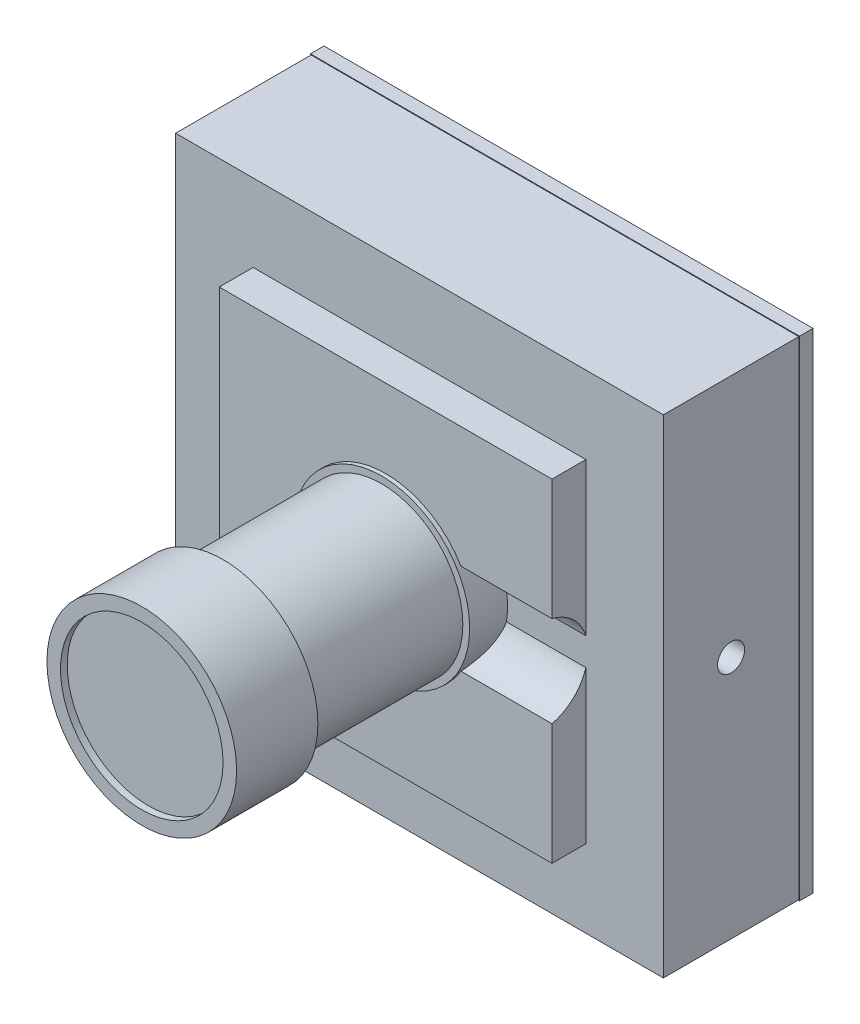
ISO-10303-21;
HEADER;
FILE_DESCRIPTION(('STEP AP214'),'2;1');
FILE_NAME('part.step','',(''),(''),'','','');
FILE_SCHEMA(('AUTOMOTIVE_DESIGN { 1 0 10303 214 1 1 1 1 }'));
ENDSEC;
DATA;
#1=APPLICATION_CONTEXT('core data for automotive mechanical design processes');
#2=APPLICATION_PROTOCOL_DEFINITION('international standard','automotive_design',2000,#1);
#3=PRODUCT_CONTEXT('',#1,'mechanical');
#4=PRODUCT('Part','Part','',(#3));
#5=PRODUCT_RELATED_PRODUCT_CATEGORY('part','',(#4));
#6=PRODUCT_DEFINITION_FORMATION('','',#4);
#7=PRODUCT_DEFINITION_CONTEXT('part definition',#1,'design');
#8=PRODUCT_DEFINITION('design','',#6,#7);
#9=PRODUCT_DEFINITION_SHAPE('','',#8);
#10=(LENGTH_UNIT() NAMED_UNIT(*) SI_UNIT(.MILLI.,.METRE.));
#11=(NAMED_UNIT(*) PLANE_ANGLE_UNIT() SI_UNIT($,.RADIAN.));
#12=(NAMED_UNIT(*) SI_UNIT($,.STERADIAN.) SOLID_ANGLE_UNIT());
#13=UNCERTAINTY_MEASURE_WITH_UNIT(LENGTH_MEASURE(1.E-05),#10,'distance_accuracy_value','');
#14=(GEOMETRIC_REPRESENTATION_CONTEXT(3) GLOBAL_UNCERTAINTY_ASSIGNED_CONTEXT((#13)) GLOBAL_UNIT_ASSIGNED_CONTEXT((#10,
#11,#12)) REPRESENTATION_CONTEXT('',''));
#15=CARTESIAN_POINT('',(0.,0.,0.));
#16=DIRECTION('',(0.,0.,1.));
#17=DIRECTION('',(1.,0.,0.));
#18=AXIS2_PLACEMENT_3D('',#15,#16,#17);
#19=CARTESIAN_POINT('',(12.28,-12.28,12.5));
#20=DIRECTION('',(-1.,0.,0.));
#21=DIRECTION('',(0.,0.,1.));
#22=AXIS2_PLACEMENT_3D('',#19,#20,#21);
#23=PLANE('',#22);
#24=DIRECTION('',(0.,1.,0.));
#25=VECTOR('',#24,1.);
#26=CARTESIAN_POINT('',(12.28,-12.28,10.));
#27=LINE('',#26,#25);
#28=CARTESIAN_POINT('',(12.28,-12.28,10.));
#29=VERTEX_POINT('',#28);
#30=CARTESIAN_POINT('',(12.28,-1.02023289507351,10.));
#31=VERTEX_POINT('',#30);
#32=EDGE_CURVE('E409',#29,#31,#27,.T.);
#33=ORIENTED_EDGE('',*,*,#32,.T.);
#34=CARTESIAN_POINT('',(12.28,0.,13.2956979290903));
#35=DIRECTION('',(1.,0.,0.));
#36=DIRECTION('',(0.,0.,1.));
#37=AXIS2_PLACEMENT_3D('',#34,#35,#36);
#38=CIRCLE('',#37,3.45);
#39=CARTESIAN_POINT('',(12.28,-3.35698745985764,12.5));
#40=VERTEX_POINT('',#39);
#41=EDGE_CURVE('E259',#40,#31,#38,.T.);
#42=ORIENTED_EDGE('',*,*,#41,.F.);
#43=DIRECTION('',(0.,1.,0.));
#44=VECTOR('',#43,1.);
#45=CARTESIAN_POINT('',(12.28,-12.28,12.5));
#46=LINE('',#45,#44);
#47=CARTESIAN_POINT('',(12.28,-12.28,12.5));
#48=VERTEX_POINT('',#47);
#49=EDGE_CURVE('E391',#48,#40,#46,.T.);
#50=ORIENTED_EDGE('',*,*,#49,.F.);
#51=DIRECTION('',(0.,0.,-1.));
#52=VECTOR('',#51,1.);
#53=CARTESIAN_POINT('',(12.28,-12.28,12.5));
#54=LINE('',#53,#52);
#55=EDGE_CURVE('E408',#48,#29,#54,.T.);
#56=ORIENTED_EDGE('',*,*,#55,.T.);
#57=EDGE_LOOP('',(#33,#42,#50,#56));
#58=FACE_BOUND('',#57,.T.);
#59=ADVANCED_FACE('F41',(#58),#23,.F.);
#60=CARTESIAN_POINT('',(0.,0.,24.5));
#61=DIRECTION('',(0.,0.,-1.));
#62=DIRECTION('',(-1.,0.,0.));
#63=AXIS2_PLACEMENT_3D('',#60,#61,#62);
#64=CYLINDRICAL_SURFACE('',#63,6.);
#65=CARTESIAN_POINT('',(0.,0.,12.8));
#66=DIRECTION('',(0.,0.,1.));
#67=DIRECTION('',(1.,0.,0.));
#68=AXIS2_PLACEMENT_3D('',#65,#66,#67);
#69=CIRCLE('',#68,6.);
#70=CARTESIAN_POINT('',(6.,0.,12.8));
#71=VERTEX_POINT('',#70);
#72=EDGE_CURVE('E457',#71,#71,#69,.T.);
#73=ORIENTED_EDGE('',*,*,#72,.T.);
#74=EDGE_LOOP('',(#73));
#75=FACE_BOUND('',#74,.T.);
#76=CARTESIAN_POINT('',(0.,0.,24.5));
#77=DIRECTION('',(0.,0.,1.));
#78=DIRECTION('',(1.,0.,0.));
#79=AXIS2_PLACEMENT_3D('',#76,#77,#78);
#80=CIRCLE('',#79,6.);
#81=CARTESIAN_POINT('',(6.,0.,24.5));
#82=VERTEX_POINT('',#81);
#83=EDGE_CURVE('E401',#82,#82,#80,.T.);
#84=ORIENTED_EDGE('',*,*,#83,.F.);
#85=EDGE_LOOP('',(#84));
#86=FACE_BOUND('',#85,.T.);
#87=ADVANCED_FACE('F359',(#75,#86),#64,.T.);
#88=CARTESIAN_POINT('',(0.,0.,30.5));
#89=DIRECTION('',(0.,0.,-1.));
#90=DIRECTION('',(-1.,0.,0.));
#91=AXIS2_PLACEMENT_3D('',#88,#89,#90);
#92=CYLINDRICAL_SURFACE('',#91,7.);
#93=CARTESIAN_POINT('',(0.,0.,30.5));
#94=DIRECTION('',(0.,0.,1.));
#95=DIRECTION('',(1.,0.,0.));
#96=AXIS2_PLACEMENT_3D('',#93,#94,#95);
#97=CIRCLE('',#96,7.);
#98=CARTESIAN_POINT('',(7.,0.,30.5));
#99=VERTEX_POINT('',#98);
#100=EDGE_CURVE('E475',#99,#99,#97,.T.);
#101=ORIENTED_EDGE('',*,*,#100,.F.);
#102=EDGE_LOOP('',(#101));
#103=FACE_BOUND('',#102,.T.);
#104=CARTESIAN_POINT('',(0.,0.,24.5));
#105=DIRECTION('',(0.,0.,1.));
#106=DIRECTION('',(1.,0.,0.));
#107=AXIS2_PLACEMENT_3D('',#104,#105,#106);
#108=CIRCLE('',#107,7.);
#109=CARTESIAN_POINT('',(7.,0.,24.5));
#110=VERTEX_POINT('',#109);
#111=EDGE_CURVE('E473',#110,#110,#108,.T.);
#112=ORIENTED_EDGE('',*,*,#111,.T.);
#113=EDGE_LOOP('',(#112));
#114=FACE_BOUND('',#113,.T.);
#115=ADVANCED_FACE('F366',(#103,#114),#92,.T.);
#116=CARTESIAN_POINT('',(0.,0.,30.5));
#117=DIRECTION('',(0.,0.,1.));
#118=DIRECTION('',(1.,0.,0.));
#119=AXIS2_PLACEMENT_3D('',#116,#117,#118);
#120=PLANE('',#119);
#121=CARTESIAN_POINT('',(0.,0.,30.5));
#122=DIRECTION('',(0.,0.,1.));
#123=DIRECTION('',(1.,0.,0.));
#124=AXIS2_PLACEMENT_3D('',#121,#122,#123);
#125=CIRCLE('',#124,6.);
#126=CARTESIAN_POINT('',(6.,0.,30.5));
#127=VERTEX_POINT('',#126);
#128=EDGE_CURVE('E459',#127,#127,#125,.T.);
#129=ORIENTED_EDGE('',*,*,#128,.F.);
#130=EDGE_LOOP('',(#129));
#131=FACE_BOUND('',#130,.T.);
#132=ORIENTED_EDGE('',*,*,#100,.T.);
#133=EDGE_LOOP('',(#132));
#134=FACE_BOUND('',#133,.T.);
#135=ADVANCED_FACE('F484',(#131,#134),#120,.T.);
#136=CARTESIAN_POINT('',(0.,0.,24.5));
#137=DIRECTION('',(0.,0.,1.));
#138=DIRECTION('',(1.,0.,0.));
#139=AXIS2_PLACEMENT_3D('',#136,#137,#138);
#140=PLANE('',#139);
#141=ORIENTED_EDGE('',*,*,#83,.T.);
#142=EDGE_LOOP('',(#141));
#143=FACE_BOUND('',#142,.T.);
#144=ORIENTED_EDGE('',*,*,#111,.F.);
#145=EDGE_LOOP('',(#144));
#146=FACE_BOUND('',#145,.T.);
#147=ADVANCED_FACE('F481',(#143,#146),#140,.F.);
#148=CARTESIAN_POINT('',(0.,0.,30.));
#149=DIRECTION('',(0.,0.,1.));
#150=DIRECTION('',(1.,0.,0.));
#151=AXIS2_PLACEMENT_3D('',#148,#149,#150);
#152=CYLINDRICAL_SURFACE('',#151,6.);
#153=CARTESIAN_POINT('',(0.,0.,30.));
#154=DIRECTION('',(0.,0.,1.));
#155=DIRECTION('',(1.,0.,0.));
#156=AXIS2_PLACEMENT_3D('',#153,#154,#155);
#157=CIRCLE('',#156,6.);
#158=CARTESIAN_POINT('',(6.,0.,30.));
#159=VERTEX_POINT('',#158);
#160=EDGE_CURVE('E463',#159,#159,#157,.T.);
#161=ORIENTED_EDGE('',*,*,#160,.F.);
#162=EDGE_LOOP('',(#161));
#163=FACE_BOUND('',#162,.T.);
#164=ORIENTED_EDGE('',*,*,#128,.T.);
#165=EDGE_LOOP('',(#164));
#166=FACE_BOUND('',#165,.T.);
#167=ADVANCED_FACE('F483',(#163,#166),#152,.F.);
#168=CARTESIAN_POINT('',(0.,0.,30.));
#169=DIRECTION('',(0.,0.,1.));
#170=DIRECTION('',(1.,0.,0.));
#171=AXIS2_PLACEMENT_3D('',#168,#169,#170);
#172=PLANE('',#171);
#173=ORIENTED_EDGE('',*,*,#160,.T.);
#174=EDGE_LOOP('',(#173));
#175=FACE_BOUND('',#174,.T.);
#176=ADVANCED_FACE('F284',(#175),#172,.T.);
#177=CARTESIAN_POINT('',(0.,0.,12.8));
#178=DIRECTION('',(0.,0.,-1.));
#179=DIRECTION('',(-1.,0.,0.));
#180=AXIS2_PLACEMENT_3D('',#177,#178,#179);
#181=CYLINDRICAL_SURFACE('',#180,6.5);
#182=CARTESIAN_POINT('',(0.,0.,12.8));
#183=DIRECTION('',(0.,0.,1.));
#184=DIRECTION('',(1.,0.,0.));
#185=AXIS2_PLACEMENT_3D('',#182,#183,#184);
#186=CIRCLE('',#185,6.5);
#187=CARTESIAN_POINT('',(6.5,0.,12.8));
#188=VERTEX_POINT('',#187);
#189=EDGE_CURVE('E460',#188,#188,#186,.T.);
#190=ORIENTED_EDGE('',*,*,#189,.F.);
#191=EDGE_LOOP('',(#190));
#192=FACE_BOUND('',#191,.T.);
#193=CARTESIAN_POINT('',(0.,0.,12.5));
#194=DIRECTION('',(0.,0.,-1.));
#195=DIRECTION('',(-1.,0.,0.));
#196=AXIS2_PLACEMENT_3D('',#193,#194,#195);
#197=CIRCLE('',#196,6.5);
#198=CARTESIAN_POINT('',(5.56602508028472,3.35698745985764,12.5));
#199=VERTEX_POINT('',#198);
#200=CARTESIAN_POINT('',(5.56602508028472,-3.35698745985764,12.5));
#201=VERTEX_POINT('',#200);
#202=EDGE_CURVE('E11',#199,#201,#197,.F.);
#203=ORIENTED_EDGE('',*,*,#202,.T.);
#204=CARTESIAN_POINT('',(5.56602508028472,-3.35698745985764,12.5));
#205=CARTESIAN_POINT('',(5.57955180700711,-3.33453979038569,12.4052884155102));
#206=CARTESIAN_POINT('',(5.59528315817957,-3.30817011921659,12.3119078433373));
#207=CARTESIAN_POINT('',(5.63045419741097,-3.2479583701722,12.1284000955498));
#208=CARTESIAN_POINT('',(5.64989044055717,-3.21412322933298,12.0382699894194));
#209=CARTESIAN_POINT('',(5.71259908682321,-3.10217473776604,11.7740240251298));
#210=CARTESIAN_POINT('',(5.76037986269082,-3.01344978345882,11.6053562810142));
#211=CARTESIAN_POINT('',(5.8617889603001,-2.81108384738308,11.2867412990591));
#212=CARTESIAN_POINT('',(5.91539872231677,-2.69752084669015,11.1367377257692));
#213=CARTESIAN_POINT('',(6.02311717254823,-2.44755817912961,10.8570324671436));
#214=CARTESIAN_POINT('',(6.0772261053561,-2.31114668596938,10.7273413630823));
#215=CARTESIAN_POINT('',(6.15846271917814,-2.08115678261641,10.5420078706021));
#216=CARTESIAN_POINT('',(6.1871926664556,-1.99436331532356,10.4784947018515));
#217=CARTESIAN_POINT('',(6.24225720743513,-1.81467538685393,10.3595348228013));
#218=CARTESIAN_POINT('',(6.26859207449666,-1.72178162401609,10.3040871915175));
#219=CARTESIAN_POINT('',(6.31809204329849,-1.53019975386337,10.2017012862647));
#220=CARTESIAN_POINT('',(6.34124672398576,-1.43149404320789,10.1547908316236));
#221=CARTESIAN_POINT('',(6.38354671265681,-1.22926376919297,10.070258513672));
#222=CARTESIAN_POINT('',(6.40268856750148,-1.12573514845534,10.0326446453708));
#223=CARTESIAN_POINT('',(6.41943337373401,-1.02023289507351,10.));
#224=B_SPLINE_CURVE_WITH_KNOTS('',3,(#204,#205,#206,#207,#208,#209,#210,#211,#212,#213,#214,
#215,#216,#217,#218,#219,#220,#221,#222,#223),.UNSPECIFIED.,.F.,.F.,(4,2,2,2,2,2,2,2,2,4),(0.,
0.294556840658693,0.588841118436535,1.17526685450148,1.75987723279939,2.34479114359943,
2.67834384162412,3.01185842212725,3.34644106199754,3.68131044751701),.UNSPECIFIED.);
#225=CARTESIAN_POINT('',(6.419433373734,-1.02023289507351,10.));
#226=VERTEX_POINT('',#225);
#227=EDGE_CURVE('E288',#201,#226,#224,.T.);
#228=ORIENTED_EDGE('',*,*,#227,.T.);
#229=CARTESIAN_POINT('',(0.,0.,10.));
#230=DIRECTION('',(0.,0.,-1.));
#231=DIRECTION('',(-1.,0.,0.));
#232=AXIS2_PLACEMENT_3D('',#229,#230,#231);
#233=CIRCLE('',#232,6.5);
#234=CARTESIAN_POINT('',(6.419433373734,1.02023289507351,10.));
#235=VERTEX_POINT('',#234);
#236=EDGE_CURVE('E273',#226,#235,#233,.F.);
#237=ORIENTED_EDGE('',*,*,#236,.T.);
#238=CARTESIAN_POINT('',(6.419433373734,1.02023289507351,10.));
#239=CARTESIAN_POINT('',(6.40457894522889,1.1137886441397,10.0289517871217));
#240=CARTESIAN_POINT('',(6.38784477980561,1.20580183277903,10.0618102463213));
#241=CARTESIAN_POINT('',(6.35115017251802,1.38611014075822,10.13490091659));
#242=CARTESIAN_POINT('',(6.33119203281755,1.47440785693412,10.1751278687177));
#243=CARTESIAN_POINT('',(6.28861614133241,1.646560204339,10.2624432920841));
#244=CARTESIAN_POINT('',(6.26600552332809,1.73042591150513,10.3095134368458));
#245=CARTESIAN_POINT('',(6.21866835550561,1.89351091780964,10.4101636047785));
#246=CARTESIAN_POINT('',(6.19394142336714,1.9727293730289,10.4637448049338));
#247=CARTESIAN_POINT('',(6.11761471582326,2.20243202195847,10.6333841534638));
#248=CARTESIAN_POINT('',(6.06372173756147,2.34553280087689,10.7586293239645));
#249=CARTESIAN_POINT('',(5.95507487177826,2.609114321631,11.0305303928114));
#250=CARTESIAN_POINT('',(5.90032071604706,2.72958785883179,11.1771930842787));
#251=CARTESIAN_POINT('',(5.789667815037,2.95762074621245,11.5070204787474));
#252=CARTESIAN_POINT('',(5.73431416865415,3.06227119506741,11.6924289783544));
#253=CARTESIAN_POINT('',(5.66183978014018,3.19313288538746,11.9850084074799));
#254=CARTESIAN_POINT('',(5.63940538924813,3.2324555459714,12.0851696007959));
#255=CARTESIAN_POINT('',(5.59906379188491,3.30182408967437,12.2896546594334));
#256=CARTESIAN_POINT('',(5.58116169816798,3.33185950449452,12.3939830734922));
#257=CARTESIAN_POINT('',(5.56602508028472,3.35698745985764,12.5));
#258=B_SPLINE_CURVE_WITH_KNOTS('',3,(#238,#239,#240,#241,#242,#243,#244,#245,#246,#247,#248,
#249,#250,#251,#252,#253,#254,#255,#256,#257),.UNSPECIFIED.,.F.,.F.,(4,2,2,2,2,2,2,2,2,4),(0.,
0.297004251508484,0.59379734927558,0.889809778982218,1.18587579780859,1.77606265836608,
2.36643712018191,3.02221015440024,3.35146986464702,3.68109936472817),.UNSPECIFIED.);
#259=EDGE_CURVE('E264',#235,#199,#258,.T.);
#260=ORIENTED_EDGE('',*,*,#259,.T.);
#261=EDGE_LOOP('',(#203,#228,#237,#260));
#262=FACE_BOUND('',#261,.T.);
#263=ADVANCED_FACE('F279',(#192,#262),#181,.T.);
#264=CARTESIAN_POINT('',(0.,0.,12.8));
#265=DIRECTION('',(0.,0.,1.));
#266=DIRECTION('',(1.,0.,0.));
#267=AXIS2_PLACEMENT_3D('',#264,#265,#266);
#268=PLANE('',#267);
#269=ORIENTED_EDGE('',*,*,#72,.F.);
#270=EDGE_LOOP('',(#269));
#271=FACE_BOUND('',#270,.T.);
#272=ORIENTED_EDGE('',*,*,#189,.T.);
#273=EDGE_LOOP('',(#272));
#274=FACE_BOUND('',#273,.T.);
#275=ADVANCED_FACE('F283',(#271,#274),#268,.T.);
#276=CARTESIAN_POINT('',(-18.,-18.,10.));
#277=DIRECTION('',(0.,1.,0.));
#278=DIRECTION('',(0.,0.,1.));
#279=AXIS2_PLACEMENT_3D('',#276,#277,#278);
#280=PLANE('',#279);
#281=DIRECTION('',(1.,0.,0.));
#282=VECTOR('',#281,1.);
#283=CARTESIAN_POINT('',(-18.,-18.,0.));
#284=LINE('',#283,#282);
#285=CARTESIAN_POINT('',(-18.,-18.,0.));
#286=VERTEX_POINT('',#285);
#287=CARTESIAN_POINT('',(18.,-18.,0.));
#288=VERTEX_POINT('',#287);
#289=EDGE_CURVE('E431',#286,#288,#284,.T.);
#290=ORIENTED_EDGE('',*,*,#289,.T.);
#291=DIRECTION('',(0.,0.,-1.));
#292=VECTOR('',#291,1.);
#293=CARTESIAN_POINT('',(18.,-18.,10.));
#294=LINE('',#293,#292);
#295=CARTESIAN_POINT('',(18.,-18.,10.));
#296=VERTEX_POINT('',#295);
#297=EDGE_CURVE('E437',#296,#288,#294,.T.);
#298=ORIENTED_EDGE('',*,*,#297,.F.);
#299=DIRECTION('',(1.,0.,0.));
#300=VECTOR('',#299,1.);
#301=CARTESIAN_POINT('',(-18.,-18.,10.));
#302=LINE('',#301,#300);
#303=CARTESIAN_POINT('',(-18.,-18.,10.));
#304=VERTEX_POINT('',#303);
#305=EDGE_CURVE('E435',#304,#296,#302,.T.);
#306=ORIENTED_EDGE('',*,*,#305,.F.);
#307=DIRECTION('',(0.,0.,-1.));
#308=VECTOR('',#307,1.);
#309=CARTESIAN_POINT('',(-18.,-18.,10.));
#310=LINE('',#309,#308);
#311=EDGE_CURVE('E450',#304,#286,#310,.T.);
#312=ORIENTED_EDGE('',*,*,#311,.T.);
#313=EDGE_LOOP('',(#290,#298,#306,#312));
#314=FACE_BOUND('',#313,.T.);
#315=ADVANCED_FACE('F676',(#314),#280,.F.);
#316=CARTESIAN_POINT('',(-18.,-18.,10.));
#317=DIRECTION('',(1.,0.,0.));
#318=DIRECTION('',(0.,0.,-1.));
#319=AXIS2_PLACEMENT_3D('',#316,#317,#318);
#320=PLANE('',#319);
#321=CARTESIAN_POINT('',(-18.,0.,5.));
#322=DIRECTION('',(1.,0.,0.));
#323=DIRECTION('',(0.,0.,-1.));
#324=AXIS2_PLACEMENT_3D('',#321,#322,#323);
#325=CIRCLE('',#324,1.);
#326=CARTESIAN_POINT('',(-18.,0.,4.));
#327=VERTEX_POINT('',#326);
#328=EDGE_CURVE('E246',#327,#327,#325,.T.);
#329=ORIENTED_EDGE('',*,*,#328,.T.);
#330=EDGE_LOOP('',(#329));
#331=FACE_BOUND('',#330,.T.);
#332=DIRECTION('',(0.,-1.,0.));
#333=VECTOR('',#332,1.);
#334=CARTESIAN_POINT('',(-18.,-18.,0.));
#335=LINE('',#334,#333);
#336=CARTESIAN_POINT('',(-18.,18.,0.));
#337=VERTEX_POINT('',#336);
#338=EDGE_CURVE('E443',#337,#286,#335,.T.);
#339=ORIENTED_EDGE('',*,*,#338,.T.);
#340=ORIENTED_EDGE('',*,*,#311,.F.);
#341=DIRECTION('',(0.,-1.,0.));
#342=VECTOR('',#341,1.);
#343=CARTESIAN_POINT('',(-18.,-18.,10.));
#344=LINE('',#343,#342);
#345=CARTESIAN_POINT('',(-18.,18.,10.));
#346=VERTEX_POINT('',#345);
#347=EDGE_CURVE('E433',#346,#304,#344,.T.);
#348=ORIENTED_EDGE('',*,*,#347,.F.);
#349=DIRECTION('',(0.,0.,-1.));
#350=VECTOR('',#349,1.);
#351=CARTESIAN_POINT('',(-18.,18.,10.));
#352=LINE('',#351,#350);
#353=EDGE_CURVE('E453',#346,#337,#352,.T.);
#354=ORIENTED_EDGE('',*,*,#353,.T.);
#355=EDGE_LOOP('',(#339,#340,#348,#354));
#356=FACE_BOUND('',#355,.T.);
#357=ADVANCED_FACE('F764',(#331,#356),#320,.F.);
#358=CARTESIAN_POINT('',(-18.,18.,10.));
#359=DIRECTION('',(0.,-1.,0.));
#360=DIRECTION('',(0.,0.,-1.));
#361=AXIS2_PLACEMENT_3D('',#358,#359,#360);
#362=PLANE('',#361);
#363=DIRECTION('',(-1.,0.,0.));
#364=VECTOR('',#363,1.);
#365=CARTESIAN_POINT('',(-18.,18.,0.));
#366=LINE('',#365,#364);
#367=CARTESIAN_POINT('',(18.,18.,0.));
#368=VERTEX_POINT('',#367);
#369=EDGE_CURVE('E440',#368,#337,#366,.T.);
#370=ORIENTED_EDGE('',*,*,#369,.T.);
#371=ORIENTED_EDGE('',*,*,#353,.F.);
#372=DIRECTION('',(-1.,0.,0.));
#373=VECTOR('',#372,1.);
#374=CARTESIAN_POINT('',(-18.,18.,10.));
#375=LINE('',#374,#373);
#376=CARTESIAN_POINT('',(18.,18.,10.));
#377=VERTEX_POINT('',#376);
#378=EDGE_CURVE('E430',#377,#346,#375,.T.);
#379=ORIENTED_EDGE('',*,*,#378,.F.);
#380=DIRECTION('',(0.,0.,-1.));
#381=VECTOR('',#380,1.);
#382=CARTESIAN_POINT('',(18.,18.,10.));
#383=LINE('',#382,#381);
#384=EDGE_CURVE('E49',#377,#368,#383,.T.);
#385=ORIENTED_EDGE('',*,*,#384,.T.);
#386=EDGE_LOOP('',(#370,#371,#379,#385));
#387=FACE_BOUND('',#386,.T.);
#388=ADVANCED_FACE('F773',(#387),#362,.F.);
#389=CARTESIAN_POINT('',(18.,-18.,10.));
#390=DIRECTION('',(-1.,0.,0.));
#391=DIRECTION('',(0.,0.,1.));
#392=AXIS2_PLACEMENT_3D('',#389,#390,#391);
#393=PLANE('',#392);
#394=CARTESIAN_POINT('',(18.,0.,5.));
#395=DIRECTION('',(1.,0.,0.));
#396=DIRECTION('',(0.,0.,-1.));
#397=AXIS2_PLACEMENT_3D('',#394,#395,#396);
#398=CIRCLE('',#397,1.);
#399=CARTESIAN_POINT('',(18.,0.,4.));
#400=VERTEX_POINT('',#399);
#401=EDGE_CURVE('E250',#400,#400,#398,.T.);
#402=ORIENTED_EDGE('',*,*,#401,.F.);
#403=EDGE_LOOP('',(#402));
#404=FACE_BOUND('',#403,.T.);
#405=DIRECTION('',(0.,1.,0.));
#406=VECTOR('',#405,1.);
#407=CARTESIAN_POINT('',(18.,-18.,0.));
#408=LINE('',#407,#406);
#409=EDGE_CURVE('E426',#288,#368,#408,.T.);
#410=ORIENTED_EDGE('',*,*,#409,.T.);
#411=ORIENTED_EDGE('',*,*,#384,.F.);
#412=DIRECTION('',(0.,1.,0.));
#413=VECTOR('',#412,1.);
#414=CARTESIAN_POINT('',(18.,-18.,10.));
#415=LINE('',#414,#413);
#416=EDGE_CURVE('E427',#296,#377,#415,.T.);
#417=ORIENTED_EDGE('',*,*,#416,.F.);
#418=ORIENTED_EDGE('',*,*,#297,.T.);
#419=EDGE_LOOP('',(#410,#411,#417,#418));
#420=FACE_BOUND('',#419,.T.);
#421=ADVANCED_FACE('F43',(#404,#420),#393,.F.);
#422=CARTESIAN_POINT('',(0.,0.,10.));
#423=DIRECTION('',(0.,0.,-1.));
#424=DIRECTION('',(-1.,0.,0.));
#425=AXIS2_PLACEMENT_3D('',#422,#423,#424);
#426=PLANE('',#425);
#427=ORIENTED_EDGE('',*,*,#416,.T.);
#428=ORIENTED_EDGE('',*,*,#378,.T.);
#429=ORIENTED_EDGE('',*,*,#347,.T.);
#430=ORIENTED_EDGE('',*,*,#305,.T.);
#431=EDGE_LOOP('',(#427,#428,#429,#430));
#432=FACE_BOUND('',#431,.T.);
#433=ORIENTED_EDGE('',*,*,#32,.F.);
#434=DIRECTION('',(1.,0.,0.));
#435=VECTOR('',#434,1.);
#436=CARTESIAN_POINT('',(-12.28,-12.28,10.));
#437=LINE('',#436,#435);
#438=CARTESIAN_POINT('',(-12.28,-12.28,10.));
#439=VERTEX_POINT('',#438);
#440=EDGE_CURVE('E392',#439,#29,#437,.T.);
#441=ORIENTED_EDGE('',*,*,#440,.F.);
#442=DIRECTION('',(0.,-1.,0.));
#443=VECTOR('',#442,1.);
#444=CARTESIAN_POINT('',(-12.28,-12.28,10.));
#445=LINE('',#444,#443);
#446=CARTESIAN_POINT('',(-12.28,12.28,10.));
#447=VERTEX_POINT('',#446);
#448=EDGE_CURVE('E397',#447,#439,#445,.T.);
#449=ORIENTED_EDGE('',*,*,#448,.F.);
#450=DIRECTION('',(-1.,0.,0.));
#451=VECTOR('',#450,1.);
#452=CARTESIAN_POINT('',(-12.28,12.28,10.));
#453=LINE('',#452,#451);
#454=CARTESIAN_POINT('',(12.28,12.28,10.));
#455=VERTEX_POINT('',#454);
#456=EDGE_CURVE('E411',#455,#447,#453,.T.);
#457=ORIENTED_EDGE('',*,*,#456,.F.);
#458=CARTESIAN_POINT('',(12.28,1.02023289507351,10.));
#459=VERTEX_POINT('',#458);
#460=EDGE_CURVE('E412',#459,#455,#27,.T.);
#461=ORIENTED_EDGE('',*,*,#460,.F.);
#462=DIRECTION('',(1.,0.,0.));
#463=VECTOR('',#462,1.);
#464=CARTESIAN_POINT('',(-18.001,1.02023289507351,10.));
#465=LINE('',#464,#463);
#466=EDGE_CURVE('E272',#235,#459,#465,.T.);
#467=ORIENTED_EDGE('',*,*,#466,.F.);
#468=ORIENTED_EDGE('',*,*,#236,.F.);
#469=DIRECTION('',(1.,0.,0.));
#470=VECTOR('',#469,1.);
#471=CARTESIAN_POINT('',(-18.001,-1.02023289507351,10.));
#472=LINE('',#471,#470);
#473=EDGE_CURVE('E295',#226,#31,#472,.T.);
#474=ORIENTED_EDGE('',*,*,#473,.T.);
#475=EDGE_LOOP('',(#433,#441,#449,#457,#461,#467,#468,#474));
#476=FACE_BOUND('',#475,.T.);
#477=ADVANCED_FACE('F502',(#432,#476),#426,.F.);
#478=CARTESIAN_POINT('',(-12.28,-12.28,12.5));
#479=DIRECTION('',(0.,1.,0.));
#480=DIRECTION('',(0.,0.,1.));
#481=AXIS2_PLACEMENT_3D('',#478,#479,#480);
#482=PLANE('',#481);
#483=ORIENTED_EDGE('',*,*,#440,.T.);
#484=ORIENTED_EDGE('',*,*,#55,.F.);
#485=DIRECTION('',(1.,0.,0.));
#486=VECTOR('',#485,1.);
#487=CARTESIAN_POINT('',(-12.28,-12.28,12.5));
#488=LINE('',#487,#486);
#489=CARTESIAN_POINT('',(-12.28,-12.28,12.5));
#490=VERTEX_POINT('',#489);
#491=EDGE_CURVE('E406',#490,#48,#488,.T.);
#492=ORIENTED_EDGE('',*,*,#491,.F.);
#493=DIRECTION('',(0.,0.,-1.));
#494=VECTOR('',#493,1.);
#495=CARTESIAN_POINT('',(-12.28,-12.28,12.5));
#496=LINE('',#495,#494);
#497=EDGE_CURVE('E419',#490,#439,#496,.T.);
#498=ORIENTED_EDGE('',*,*,#497,.T.);
#499=EDGE_LOOP('',(#483,#484,#492,#498));
#500=FACE_BOUND('',#499,.T.);
#501=ADVANCED_FACE('F499',(#500),#482,.F.);
#502=CARTESIAN_POINT('',(-12.28,-12.28,12.5));
#503=DIRECTION('',(1.,0.,0.));
#504=DIRECTION('',(0.,0.,-1.));
#505=AXIS2_PLACEMENT_3D('',#502,#503,#504);
#506=PLANE('',#505);
#507=ORIENTED_EDGE('',*,*,#448,.T.);
#508=ORIENTED_EDGE('',*,*,#497,.F.);
#509=DIRECTION('',(0.,-1.,0.));
#510=VECTOR('',#509,1.);
#511=CARTESIAN_POINT('',(-12.28,-12.28,12.5));
#512=LINE('',#511,#510);
#513=CARTESIAN_POINT('',(-12.28,12.28,12.5));
#514=VERTEX_POINT('',#513);
#515=EDGE_CURVE('E404',#514,#490,#512,.T.);
#516=ORIENTED_EDGE('',*,*,#515,.F.);
#517=DIRECTION('',(0.,0.,-1.));
#518=VECTOR('',#517,1.);
#519=CARTESIAN_POINT('',(-12.28,12.28,12.5));
#520=LINE('',#519,#518);
#521=EDGE_CURVE('E422',#514,#447,#520,.T.);
#522=ORIENTED_EDGE('',*,*,#521,.T.);
#523=EDGE_LOOP('',(#507,#508,#516,#522));
#524=FACE_BOUND('',#523,.T.);
#525=ADVANCED_FACE('F381',(#524),#506,.F.);
#526=CARTESIAN_POINT('',(-12.28,12.28,12.5));
#527=DIRECTION('',(0.,-1.,0.));
#528=DIRECTION('',(0.,0.,-1.));
#529=AXIS2_PLACEMENT_3D('',#526,#527,#528);
#530=PLANE('',#529);
#531=ORIENTED_EDGE('',*,*,#456,.T.);
#532=ORIENTED_EDGE('',*,*,#521,.F.);
#533=DIRECTION('',(-1.,0.,0.));
#534=VECTOR('',#533,1.);
#535=CARTESIAN_POINT('',(-12.28,12.28,12.5));
#536=LINE('',#535,#534);
#537=CARTESIAN_POINT('',(12.28,12.28,12.5));
#538=VERTEX_POINT('',#537);
#539=EDGE_CURVE('E395',#538,#514,#536,.T.);
#540=ORIENTED_EDGE('',*,*,#539,.F.);
#541=DIRECTION('',(0.,0.,-1.));
#542=VECTOR('',#541,1.);
#543=CARTESIAN_POINT('',(12.28,12.28,12.5));
#544=LINE('',#543,#542);
#545=EDGE_CURVE('E389',#538,#455,#544,.T.);
#546=ORIENTED_EDGE('',*,*,#545,.T.);
#547=EDGE_LOOP('',(#531,#532,#540,#546));
#548=FACE_BOUND('',#547,.T.);
#549=ADVANCED_FACE('F373',(#548),#530,.F.);
#550=CARTESIAN_POINT('',(12.28,3.35698745985764,12.5));
#551=VERTEX_POINT('',#550);
#552=EDGE_CURVE('E386',#551,#538,#46,.T.);
#553=ORIENTED_EDGE('',*,*,#552,.F.);
#554=CARTESIAN_POINT('',(12.28,0.,13.2956979290903));
#555=DIRECTION('',(1.,0.,0.));
#556=DIRECTION('',(0.,0.,1.));
#557=AXIS2_PLACEMENT_3D('',#554,#555,#556);
#558=CIRCLE('',#557,3.45);
#559=EDGE_CURVE('E256',#459,#551,#558,.T.);
#560=ORIENTED_EDGE('',*,*,#559,.F.);
#561=ORIENTED_EDGE('',*,*,#460,.T.);
#562=ORIENTED_EDGE('',*,*,#545,.F.);
#563=EDGE_LOOP('',(#553,#560,#561,#562));
#564=FACE_BOUND('',#563,.T.);
#565=ADVANCED_FACE('F362',(#564),#23,.F.);
#566=CARTESIAN_POINT('',(0.,0.,12.5));
#567=DIRECTION('',(0.,0.,-1.));
#568=DIRECTION('',(-1.,0.,0.));
#569=AXIS2_PLACEMENT_3D('',#566,#567,#568);
#570=PLANE('',#569);
#571=ORIENTED_EDGE('',*,*,#49,.T.);
#572=DIRECTION('',(1.,0.,0.));
#573=VECTOR('',#572,1.);
#574=CARTESIAN_POINT('',(-18.001,-3.35698745985764,12.5));
#575=LINE('',#574,#573);
#576=EDGE_CURVE('E262',#201,#40,#575,.T.);
#577=ORIENTED_EDGE('',*,*,#576,.F.);
#578=ORIENTED_EDGE('',*,*,#202,.F.);
#579=DIRECTION('',(1.,0.,0.));
#580=VECTOR('',#579,1.);
#581=CARTESIAN_POINT('',(-18.001,3.35698745985764,12.5));
#582=LINE('',#581,#580);
#583=EDGE_CURVE('E64',#199,#551,#582,.T.);
#584=ORIENTED_EDGE('',*,*,#583,.T.);
#585=ORIENTED_EDGE('',*,*,#552,.T.);
#586=ORIENTED_EDGE('',*,*,#539,.T.);
#587=ORIENTED_EDGE('',*,*,#515,.T.);
#588=ORIENTED_EDGE('',*,*,#491,.T.);
#589=EDGE_LOOP('',(#571,#577,#578,#584,#585,#586,#587,#588));
#590=FACE_BOUND('',#589,.T.);
#591=ADVANCED_FACE('F301',(#590),#570,.F.);
#592=CARTESIAN_POINT('',(-18.001,0.,13.2956979290903));
#593=DIRECTION('',(1.,0.,0.));
#594=DIRECTION('',(0.,0.,-1.));
#595=AXIS2_PLACEMENT_3D('',#592,#593,#594);
#596=CYLINDRICAL_SURFACE('',#595,3.45);
#597=ORIENTED_EDGE('',*,*,#576,.T.);
#598=ORIENTED_EDGE('',*,*,#41,.T.);
#599=ORIENTED_EDGE('',*,*,#473,.F.);
#600=ORIENTED_EDGE('',*,*,#227,.F.);
#601=EDGE_LOOP('',(#597,#598,#599,#600));
#602=FACE_BOUND('',#601,.T.);
#603=ADVANCED_FACE('F297',(#602),#596,.F.);
#604=CARTESIAN_POINT('',(-18.001,0.,13.2956979290903));
#605=DIRECTION('',(1.,0.,0.));
#606=DIRECTION('',(0.,0.,-1.));
#607=AXIS2_PLACEMENT_3D('',#604,#605,#606);
#608=CYLINDRICAL_SURFACE('',#607,3.45);
#609=ORIENTED_EDGE('',*,*,#466,.T.);
#610=ORIENTED_EDGE('',*,*,#559,.T.);
#611=ORIENTED_EDGE('',*,*,#583,.F.);
#612=ORIENTED_EDGE('',*,*,#259,.F.);
#613=EDGE_LOOP('',(#609,#610,#611,#612));
#614=FACE_BOUND('',#613,.T.);
#615=ADVANCED_FACE('F275',(#614),#608,.F.);
#616=CARTESIAN_POINT('',(15.,0.,5.));
#617=DIRECTION('',(1.,0.,0.));
#618=DIRECTION('',(0.,0.,-1.));
#619=AXIS2_PLACEMENT_3D('',#616,#617,#618);
#620=CYLINDRICAL_SURFACE('',#619,1.);
#621=CARTESIAN_POINT('',(15.,0.,5.));
#622=DIRECTION('',(1.,0.,0.));
#623=DIRECTION('',(0.,0.,-1.));
#624=AXIS2_PLACEMENT_3D('',#621,#622,#623);
#625=CIRCLE('',#624,1.);
#626=CARTESIAN_POINT('',(15.,0.,4.));
#627=VERTEX_POINT('',#626);
#628=EDGE_CURVE('E253',#627,#627,#625,.T.);
#629=ORIENTED_EDGE('',*,*,#628,.F.);
#630=EDGE_LOOP('',(#629));
#631=FACE_BOUND('',#630,.T.);
#632=ORIENTED_EDGE('',*,*,#401,.T.);
#633=EDGE_LOOP('',(#632));
#634=FACE_BOUND('',#633,.T.);
#635=ADVANCED_FACE('F303',(#631,#634),#620,.F.);
#636=CARTESIAN_POINT('',(15.,0.,5.));
#637=DIRECTION('',(1.,0.,0.));
#638=DIRECTION('',(0.,0.,-1.));
#639=AXIS2_PLACEMENT_3D('',#636,#637,#638);
#640=PLANE('',#639);
#641=ORIENTED_EDGE('',*,*,#628,.T.);
#642=EDGE_LOOP('',(#641));
#643=FACE_BOUND('',#642,.T.);
#644=ADVANCED_FACE('F306',(#643),#640,.T.);
#645=CARTESIAN_POINT('',(-15.,0.,5.));
#646=DIRECTION('',(-1.,0.,0.));
#647=DIRECTION('',(0.,0.,1.));
#648=AXIS2_PLACEMENT_3D('',#645,#646,#647);
#649=CYLINDRICAL_SURFACE('',#648,1.);
#650=CARTESIAN_POINT('',(-15.,0.,5.));
#651=DIRECTION('',(1.,0.,0.));
#652=DIRECTION('',(0.,0.,-1.));
#653=AXIS2_PLACEMENT_3D('',#650,#651,#652);
#654=CIRCLE('',#653,1.);
#655=CARTESIAN_POINT('',(-15.,0.,4.));
#656=VERTEX_POINT('',#655);
#657=EDGE_CURVE('E247',#656,#656,#654,.T.);
#658=ORIENTED_EDGE('',*,*,#657,.T.);
#659=EDGE_LOOP('',(#658));
#660=FACE_BOUND('',#659,.T.);
#661=ORIENTED_EDGE('',*,*,#328,.F.);
#662=EDGE_LOOP('',(#661));
#663=FACE_BOUND('',#662,.T.);
#664=ADVANCED_FACE('F310',(#660,#663),#649,.F.);
#665=CARTESIAN_POINT('',(-15.,0.,5.));
#666=DIRECTION('',(-1.,0.,0.));
#667=DIRECTION('',(0.,0.,-1.));
#668=AXIS2_PLACEMENT_3D('',#665,#666,#667);
#669=PLANE('',#668);
#670=ORIENTED_EDGE('',*,*,#657,.F.);
#671=EDGE_LOOP('',(#670));
#672=FACE_BOUND('',#671,.T.);
#673=ADVANCED_FACE('F314',(#672),#669,.T.);
#674=CARTESIAN_POINT('',(0.,0.,0.));
#675=DIRECTION('',(0.,0.,1.));
#676=DIRECTION('',(1.,0.,0.));
#677=AXIS2_PLACEMENT_3D('',#674,#675,#676);
#678=PLANE('',#677);
#679=DIRECTION('',(0.,1.,0.));
#680=VECTOR('',#679,1.);
#681=CARTESIAN_POINT('',(-18.05,-18.05,0.));
#682=LINE('',#681,#680);
#683=CARTESIAN_POINT('',(-18.05,-18.05,0.));
#684=VERTEX_POINT('',#683);
#685=CARTESIAN_POINT('',(-18.05,18.05,0.));
#686=VERTEX_POINT('',#685);
#687=EDGE_CURVE('E213',#684,#686,#682,.T.);
#688=ORIENTED_EDGE('',*,*,#687,.F.);
#689=DIRECTION('',(-1.,0.,0.));
#690=VECTOR('',#689,1.);
#691=CARTESIAN_POINT('',(18.05,-18.05,0.));
#692=LINE('',#691,#690);
#693=CARTESIAN_POINT('',(18.05,-18.05,0.));
#694=VERTEX_POINT('',#693);
#695=EDGE_CURVE('E221',#694,#684,#692,.T.);
#696=ORIENTED_EDGE('',*,*,#695,.F.);
#697=DIRECTION('',(0.,-1.,0.));
#698=VECTOR('',#697,1.);
#699=CARTESIAN_POINT('',(18.05,-18.05,0.));
#700=LINE('',#699,#698);
#701=CARTESIAN_POINT('',(18.05,18.05,0.));
#702=VERTEX_POINT('',#701);
#703=EDGE_CURVE('E232',#702,#694,#700,.T.);
#704=ORIENTED_EDGE('',*,*,#703,.F.);
#705=DIRECTION('',(1.,0.,0.));
#706=VECTOR('',#705,1.);
#707=CARTESIAN_POINT('',(18.05,18.05,0.));
#708=LINE('',#707,#706);
#709=EDGE_CURVE('E230',#686,#702,#708,.T.);
#710=ORIENTED_EDGE('',*,*,#709,.F.);
#711=EDGE_LOOP('',(#688,#696,#704,#710));
#712=FACE_BOUND('',#711,.T.);
#713=ORIENTED_EDGE('',*,*,#409,.F.);
#714=ORIENTED_EDGE('',*,*,#289,.F.);
#715=ORIENTED_EDGE('',*,*,#338,.F.);
#716=ORIENTED_EDGE('',*,*,#369,.F.);
#717=EDGE_LOOP('',(#713,#714,#715,#716));
#718=FACE_BOUND('',#717,.T.);
#719=ADVANCED_FACE('F318',(#712,#718),#678,.T.);
#720=CARTESIAN_POINT('',(-18.05,-18.05,-1.));
#721=DIRECTION('',(1.,0.,0.));
#722=DIRECTION('',(0.,0.,-1.));
#723=AXIS2_PLACEMENT_3D('',#720,#721,#722);
#724=PLANE('',#723);
#725=ORIENTED_EDGE('',*,*,#687,.T.);
#726=DIRECTION('',(0.,0.,1.));
#727=VECTOR('',#726,1.);
#728=CARTESIAN_POINT('',(-18.05,18.05,-1.));
#729=LINE('',#728,#727);
#730=CARTESIAN_POINT('',(-18.05,18.05,-1.));
#731=VERTEX_POINT('',#730);
#732=EDGE_CURVE('E243',#731,#686,#729,.T.);
#733=ORIENTED_EDGE('',*,*,#732,.F.);
#734=DIRECTION('',(0.,1.,0.));
#735=VECTOR('',#734,1.);
#736=CARTESIAN_POINT('',(-18.05,-18.05,-1.));
#737=LINE('',#736,#735);
#738=CARTESIAN_POINT('',(-18.05,-18.05,-1.));
#739=VERTEX_POINT('',#738);
#740=EDGE_CURVE('E217',#739,#731,#737,.T.);
#741=ORIENTED_EDGE('',*,*,#740,.F.);
#742=DIRECTION('',(0.,0.,1.));
#743=VECTOR('',#742,1.);
#744=CARTESIAN_POINT('',(-18.05,-18.05,-1.));
#745=LINE('',#744,#743);
#746=EDGE_CURVE('E227',#739,#684,#745,.T.);
#747=ORIENTED_EDGE('',*,*,#746,.T.);
#748=EDGE_LOOP('',(#725,#733,#741,#747));
#749=FACE_BOUND('',#748,.T.);
#750=ADVANCED_FACE('F320',(#749),#724,.F.);
#751=CARTESIAN_POINT('',(18.05,18.05,-1.));
#752=DIRECTION('',(0.,-1.,0.));
#753=DIRECTION('',(0.,0.,-1.));
#754=AXIS2_PLACEMENT_3D('',#751,#752,#753);
#755=PLANE('',#754);
#756=ORIENTED_EDGE('',*,*,#709,.T.);
#757=DIRECTION('',(0.,0.,1.));
#758=VECTOR('',#757,1.);
#759=CARTESIAN_POINT('',(18.05,18.05,-1.));
#760=LINE('',#759,#758);
#761=CARTESIAN_POINT('',(18.05,18.05,-1.));
#762=VERTEX_POINT('',#761);
#763=EDGE_CURVE('E240',#762,#702,#760,.T.);
#764=ORIENTED_EDGE('',*,*,#763,.F.);
#765=DIRECTION('',(1.,0.,0.));
#766=VECTOR('',#765,1.);
#767=CARTESIAN_POINT('',(18.05,18.05,-1.));
#768=LINE('',#767,#766);
#769=EDGE_CURVE('E220',#731,#762,#768,.T.);
#770=ORIENTED_EDGE('',*,*,#769,.F.);
#771=ORIENTED_EDGE('',*,*,#732,.T.);
#772=EDGE_LOOP('',(#756,#764,#770,#771));
#773=FACE_BOUND('',#772,.T.);
#774=ADVANCED_FACE('F323',(#773),#755,.F.);
#775=CARTESIAN_POINT('',(18.05,-18.05,-1.));
#776=DIRECTION('',(-1.,0.,0.));
#777=DIRECTION('',(0.,0.,1.));
#778=AXIS2_PLACEMENT_3D('',#775,#776,#777);
#779=PLANE('',#778);
#780=ORIENTED_EDGE('',*,*,#703,.T.);
#781=DIRECTION('',(0.,0.,1.));
#782=VECTOR('',#781,1.);
#783=CARTESIAN_POINT('',(18.05,-18.05,-1.));
#784=LINE('',#783,#782);
#785=CARTESIAN_POINT('',(18.05,-18.05,-1.));
#786=VERTEX_POINT('',#785);
#787=EDGE_CURVE('E237',#786,#694,#784,.T.);
#788=ORIENTED_EDGE('',*,*,#787,.F.);
#789=DIRECTION('',(0.,-1.,0.));
#790=VECTOR('',#789,1.);
#791=CARTESIAN_POINT('',(18.05,-18.05,-1.));
#792=LINE('',#791,#790);
#793=EDGE_CURVE('E223',#762,#786,#792,.T.);
#794=ORIENTED_EDGE('',*,*,#793,.F.);
#795=ORIENTED_EDGE('',*,*,#763,.T.);
#796=EDGE_LOOP('',(#780,#788,#794,#795));
#797=FACE_BOUND('',#796,.T.);
#798=ADVANCED_FACE('F327',(#797),#779,.F.);
#799=CARTESIAN_POINT('',(18.05,-18.05,-1.));
#800=DIRECTION('',(0.,1.,0.));
#801=DIRECTION('',(0.,0.,1.));
#802=AXIS2_PLACEMENT_3D('',#799,#800,#801);
#803=PLANE('',#802);
#804=ORIENTED_EDGE('',*,*,#695,.T.);
#805=ORIENTED_EDGE('',*,*,#746,.F.);
#806=DIRECTION('',(-1.,0.,0.));
#807=VECTOR('',#806,1.);
#808=CARTESIAN_POINT('',(18.05,-18.05,-1.));
#809=LINE('',#808,#807);
#810=EDGE_CURVE('E225',#786,#739,#809,.T.);
#811=ORIENTED_EDGE('',*,*,#810,.F.);
#812=ORIENTED_EDGE('',*,*,#787,.T.);
#813=EDGE_LOOP('',(#804,#805,#811,#812));
#814=FACE_BOUND('',#813,.T.);
#815=ADVANCED_FACE('F331',(#814),#803,.F.);
#816=CARTESIAN_POINT('',(0.,0.,-1.));
#817=DIRECTION('',(0.,0.,1.));
#818=DIRECTION('',(1.,0.,0.));
#819=AXIS2_PLACEMENT_3D('',#816,#817,#818);
#820=PLANE('',#819);
#821=DIRECTION('',(1.,0.,0.));
#822=VECTOR('',#821,1.);
#823=CARTESIAN_POINT('',(5.5,-10.55,-1.));
#824=LINE('',#823,#822);
#825=CARTESIAN_POINT('',(-5.5,-10.55,-1.));
#826=VERTEX_POINT('',#825);
#827=CARTESIAN_POINT('',(5.5,-10.55,-1.));
#828=VERTEX_POINT('',#827);
#829=EDGE_CURVE('E207',#826,#828,#824,.T.);
#830=ORIENTED_EDGE('',*,*,#829,.F.);
#831=DIRECTION('',(0.,1.,0.));
#832=VECTOR('',#831,1.);
#833=CARTESIAN_POINT('',(-5.5,-10.55,-1.));
#834=LINE('',#833,#832);
#835=CARTESIAN_POINT('',(-5.5,-15.55,-1.));
#836=VERTEX_POINT('',#835);
#837=EDGE_CURVE('E56',#836,#826,#834,.T.);
#838=ORIENTED_EDGE('',*,*,#837,.F.);
#839=DIRECTION('',(-1.,0.,0.));
#840=VECTOR('',#839,1.);
#841=CARTESIAN_POINT('',(-5.5,-15.55,-1.));
#842=LINE('',#841,#840);
#843=CARTESIAN_POINT('',(5.5,-15.55,-1.));
#844=VERTEX_POINT('',#843);
#845=EDGE_CURVE('E198',#844,#836,#842,.T.);
#846=ORIENTED_EDGE('',*,*,#845,.F.);
#847=DIRECTION('',(0.,-1.,0.));
#848=VECTOR('',#847,1.);
#849=CARTESIAN_POINT('',(5.5,-10.55,-1.));
#850=LINE('',#849,#848);
#851=EDGE_CURVE('E201',#828,#844,#850,.T.);
#852=ORIENTED_EDGE('',*,*,#851,.F.);
#853=EDGE_LOOP('',(#830,#838,#846,#852));
#854=FACE_BOUND('',#853,.T.);
#855=ORIENTED_EDGE('',*,*,#740,.T.);
#856=ORIENTED_EDGE('',*,*,#769,.T.);
#857=ORIENTED_EDGE('',*,*,#793,.T.);
#858=ORIENTED_EDGE('',*,*,#810,.T.);
#859=EDGE_LOOP('',(#855,#856,#857,#858));
#860=FACE_BOUND('',#859,.T.);
#861=ADVANCED_FACE('F335',(#854,#860),#820,.F.);
#862=CARTESIAN_POINT('',(-5.5,-10.55,4.));
#863=DIRECTION('',(-1.,0.,0.));
#864=DIRECTION('',(0.,0.,1.));
#865=AXIS2_PLACEMENT_3D('',#862,#863,#864);
#866=PLANE('',#865);
#867=ORIENTED_EDGE('',*,*,#837,.T.);
#868=DIRECTION('',(0.,0.,-1.));
#869=VECTOR('',#868,1.);
#870=CARTESIAN_POINT('',(-5.5,-10.55,4.));
#871=LINE('',#870,#869);
#872=CARTESIAN_POINT('',(-5.5,-10.55,4.));
#873=VERTEX_POINT('',#872);
#874=EDGE_CURVE('E176',#873,#826,#871,.T.);
#875=ORIENTED_EDGE('',*,*,#874,.F.);
#876=DIRECTION('',(0.,1.,0.));
#877=VECTOR('',#876,1.);
#878=CARTESIAN_POINT('',(-5.5,-10.55,4.));
#879=LINE('',#878,#877);
#880=CARTESIAN_POINT('',(-5.5,-15.55,4.));
#881=VERTEX_POINT('',#880);
#882=EDGE_CURVE('E180',#881,#873,#879,.T.);
#883=ORIENTED_EDGE('',*,*,#882,.F.);
#884=DIRECTION('',(0.,0.,-1.));
#885=VECTOR('',#884,1.);
#886=CARTESIAN_POINT('',(-5.5,-15.55,4.));
#887=LINE('',#886,#885);
#888=EDGE_CURVE('E211',#881,#836,#887,.T.);
#889=ORIENTED_EDGE('',*,*,#888,.T.);
#890=EDGE_LOOP('',(#867,#875,#883,#889));
#891=FACE_BOUND('',#890,.T.);
#892=ADVANCED_FACE('F178',(#891),#866,.F.);
#893=CARTESIAN_POINT('',(-5.5,-15.55,4.));
#894=DIRECTION('',(0.,-1.,0.));
#895=DIRECTION('',(0.,0.,-1.));
#896=AXIS2_PLACEMENT_3D('',#893,#894,#895);
#897=PLANE('',#896);
#898=ORIENTED_EDGE('',*,*,#845,.T.);
#899=ORIENTED_EDGE('',*,*,#888,.F.);
#900=DIRECTION('',(-1.,0.,0.));
#901=VECTOR('',#900,1.);
#902=CARTESIAN_POINT('',(-5.5,-15.55,4.));
#903=LINE('',#902,#901);
#904=CARTESIAN_POINT('',(5.5,-15.55,4.));
#905=VERTEX_POINT('',#904);
#906=EDGE_CURVE('E186',#905,#881,#903,.T.);
#907=ORIENTED_EDGE('',*,*,#906,.F.);
#908=DIRECTION('',(0.,0.,-1.));
#909=VECTOR('',#908,1.);
#910=CARTESIAN_POINT('',(5.5,-15.55,4.));
#911=LINE('',#910,#909);
#912=EDGE_CURVE('E214',#905,#844,#911,.T.);
#913=ORIENTED_EDGE('',*,*,#912,.T.);
#914=EDGE_LOOP('',(#898,#899,#907,#913));
#915=FACE_BOUND('',#914,.T.);
#916=ADVANCED_FACE('F345',(#915),#897,.F.);
#917=CARTESIAN_POINT('',(5.5,-10.55,4.));
#918=DIRECTION('',(1.,0.,0.));
#919=DIRECTION('',(0.,0.,-1.));
#920=AXIS2_PLACEMENT_3D('',#917,#918,#919);
#921=PLANE('',#920);
#922=ORIENTED_EDGE('',*,*,#851,.T.);
#923=ORIENTED_EDGE('',*,*,#912,.F.);
#924=DIRECTION('',(0.,-1.,0.));
#925=VECTOR('',#924,1.);
#926=CARTESIAN_POINT('',(5.5,-10.55,4.));
#927=LINE('',#926,#925);
#928=CARTESIAN_POINT('',(5.5,-10.55,4.));
#929=VERTEX_POINT('',#928);
#930=EDGE_CURVE('E194',#929,#905,#927,.T.);
#931=ORIENTED_EDGE('',*,*,#930,.F.);
#932=DIRECTION('',(0.,0.,-1.));
#933=VECTOR('',#932,1.);
#934=CARTESIAN_POINT('',(5.5,-10.55,4.));
#935=LINE('',#934,#933);
#936=EDGE_CURVE('E185',#929,#828,#935,.T.);
#937=ORIENTED_EDGE('',*,*,#936,.T.);
#938=EDGE_LOOP('',(#922,#923,#931,#937));
#939=FACE_BOUND('',#938,.T.);
#940=ADVANCED_FACE('F348',(#939),#921,.F.);
#941=CARTESIAN_POINT('',(5.5,-10.55,4.));
#942=DIRECTION('',(0.,1.,0.));
#943=DIRECTION('',(0.,0.,1.));
#944=AXIS2_PLACEMENT_3D('',#941,#942,#943);
#945=PLANE('',#944);
#946=ORIENTED_EDGE('',*,*,#829,.T.);
#947=ORIENTED_EDGE('',*,*,#936,.F.);
#948=DIRECTION('',(1.,0.,0.));
#949=VECTOR('',#948,1.);
#950=CARTESIAN_POINT('',(5.5,-10.55,4.));
#951=LINE('',#950,#949);
#952=EDGE_CURVE('E189',#873,#929,#951,.T.);
#953=ORIENTED_EDGE('',*,*,#952,.F.);
#954=ORIENTED_EDGE('',*,*,#874,.T.);
#955=EDGE_LOOP('',(#946,#947,#953,#954));
#956=FACE_BOUND('',#955,.T.);
#957=ADVANCED_FACE('F190',(#956),#945,.F.);
#958=CARTESIAN_POINT('',(0.,0.,4.));
#959=DIRECTION('',(0.,0.,1.));
#960=DIRECTION('',(1.,0.,0.));
#961=AXIS2_PLACEMENT_3D('',#958,#959,#960);
#962=PLANE('',#961);
#963=ORIENTED_EDGE('',*,*,#882,.T.);
#964=ORIENTED_EDGE('',*,*,#952,.T.);
#965=ORIENTED_EDGE('',*,*,#930,.T.);
#966=ORIENTED_EDGE('',*,*,#906,.T.);
#967=EDGE_LOOP('',(#963,#964,#965,#966));
#968=FACE_BOUND('',#967,.T.);
#969=ADVANCED_FACE('F196',(#968),#962,.F.);
#970=CLOSED_SHELL('',(#59,#87,#115,#135,#147,#167,#176,#263,#275,#315,#357,#388,#421,#477,#501,
#525,#549,#565,#591,#603,#615,#635,#644,#664,#673,#719,#750,#774,#798,#815,#861,#892,#916,#940,
#957,#969));
#971=MANIFOLD_SOLID_BREP('B2',#970);
#972=ADVANCED_BREP_SHAPE_REPRESENTATION('',(#18,#971),#14);
#973=SHAPE_DEFINITION_REPRESENTATION(#9,#972);
ENDSEC;
END-ISO-10303-21;
